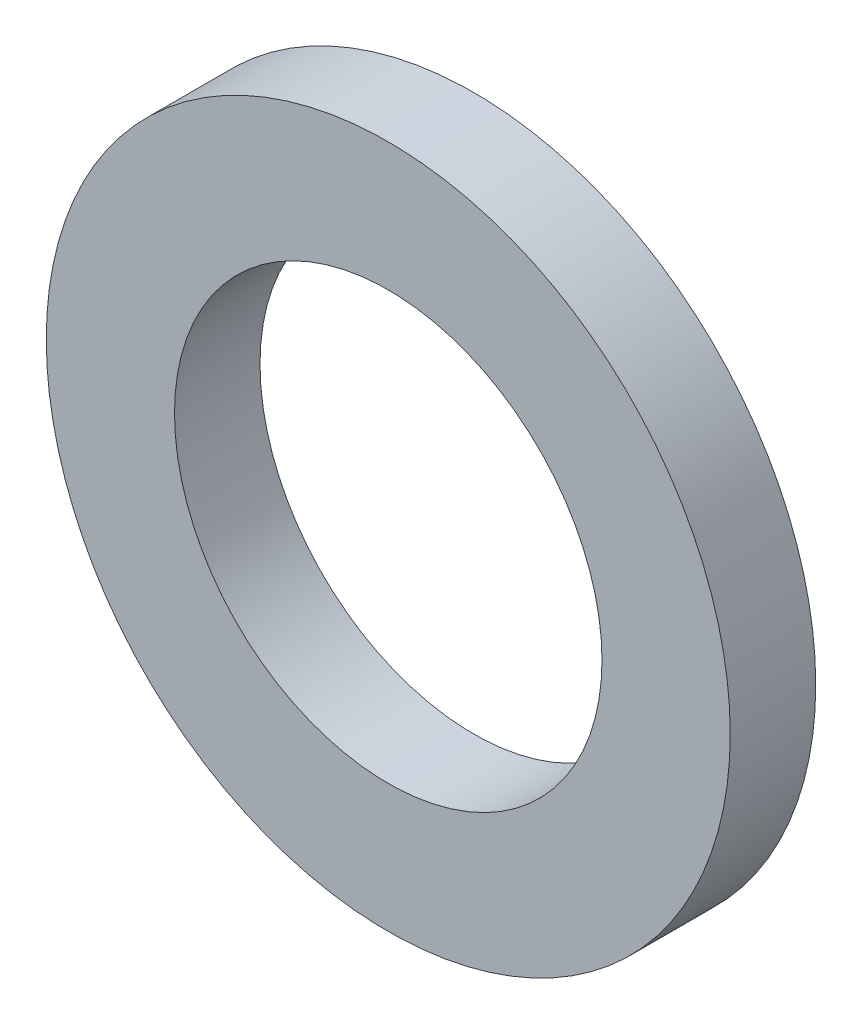
ISO-10303-21;
HEADER;
FILE_DESCRIPTION(('STEP AP214'),'2;1');
FILE_NAME('part.step','',(''),(''),'','','');
FILE_SCHEMA(('AUTOMOTIVE_DESIGN { 1 0 10303 214 1 1 1 1 }'));
ENDSEC;
DATA;
#1=APPLICATION_CONTEXT('core data for automotive mechanical design processes');
#2=APPLICATION_PROTOCOL_DEFINITION('international standard','automotive_design',2000,#1);
#3=PRODUCT_CONTEXT('',#1,'mechanical');
#4=PRODUCT('Part','Part','',(#3));
#5=PRODUCT_RELATED_PRODUCT_CATEGORY('part','',(#4));
#6=PRODUCT_DEFINITION_FORMATION('','',#4);
#7=PRODUCT_DEFINITION_CONTEXT('part definition',#1,'design');
#8=PRODUCT_DEFINITION('design','',#6,#7);
#9=PRODUCT_DEFINITION_SHAPE('','',#8);
#10=(LENGTH_UNIT() NAMED_UNIT(*) SI_UNIT(.MILLI.,.METRE.));
#11=(NAMED_UNIT(*) PLANE_ANGLE_UNIT() SI_UNIT($,.RADIAN.));
#12=(NAMED_UNIT(*) SI_UNIT($,.STERADIAN.) SOLID_ANGLE_UNIT());
#13=UNCERTAINTY_MEASURE_WITH_UNIT(LENGTH_MEASURE(1.E-05),#10,'distance_accuracy_value','');
#14=(GEOMETRIC_REPRESENTATION_CONTEXT(3) GLOBAL_UNCERTAINTY_ASSIGNED_CONTEXT((#13)) GLOBAL_UNIT_ASSIGNED_CONTEXT((#10,
#11,#12)) REPRESENTATION_CONTEXT('',''));
#15=CARTESIAN_POINT('',(0.,0.,0.));
#16=DIRECTION('',(0.,0.,1.));
#17=DIRECTION('',(1.,0.,0.));
#18=AXIS2_PLACEMENT_3D('',#15,#16,#17);
#19=CARTESIAN_POINT('',(0.,0.,3.175));
#20=DIRECTION('',(0.,0.,1.));
#21=DIRECTION('',(1.,0.,0.));
#22=AXIS2_PLACEMENT_3D('',#19,#20,#21);
#23=PLANE('',#22);
#24=CARTESIAN_POINT('',(0.,0.,3.175));
#25=DIRECTION('',(0.,0.,1.));
#26=DIRECTION('',(1.,0.,0.));
#27=AXIS2_PLACEMENT_3D('',#24,#25,#26);
#28=CIRCLE('',#27,12.7);
#29=CARTESIAN_POINT('',(12.7,0.,3.175));
#30=VERTEX_POINT('',#29);
#31=EDGE_CURVE('E10',#30,#30,#28,.T.);
#32=ORIENTED_EDGE('',*,*,#31,.T.);
#33=EDGE_LOOP('',(#32));
#34=FACE_BOUND('',#33,.T.);
#35=CARTESIAN_POINT('',(0.,0.,3.175));
#36=DIRECTION('',(0.,0.,1.));
#37=DIRECTION('',(1.,0.,0.));
#38=AXIS2_PLACEMENT_3D('',#35,#36,#37);
#39=CIRCLE('',#38,7.9375);
#40=CARTESIAN_POINT('',(7.9375,0.,3.175));
#41=VERTEX_POINT('',#40);
#42=EDGE_CURVE('E42',#41,#41,#39,.T.);
#43=ORIENTED_EDGE('',*,*,#42,.F.);
#44=EDGE_LOOP('',(#43));
#45=FACE_BOUND('',#44,.T.);
#46=ADVANCED_FACE('F31',(#34,#45),#23,.T.);
#47=CARTESIAN_POINT('',(0.,0.,0.));
#48=DIRECTION('',(0.,0.,1.));
#49=DIRECTION('',(1.,0.,0.));
#50=AXIS2_PLACEMENT_3D('',#47,#48,#49);
#51=PLANE('',#50);
#52=CARTESIAN_POINT('',(0.,0.,0.));
#53=DIRECTION('',(0.,0.,1.));
#54=DIRECTION('',(1.,0.,0.));
#55=AXIS2_PLACEMENT_3D('',#52,#53,#54);
#56=CIRCLE('',#55,12.7);
#57=CARTESIAN_POINT('',(12.7,0.,0.));
#58=VERTEX_POINT('',#57);
#59=EDGE_CURVE('E35',#58,#58,#56,.T.);
#60=ORIENTED_EDGE('',*,*,#59,.F.);
#61=EDGE_LOOP('',(#60));
#62=FACE_BOUND('',#61,.T.);
#63=CARTESIAN_POINT('',(0.,0.,0.));
#64=DIRECTION('',(0.,0.,1.));
#65=DIRECTION('',(1.,0.,0.));
#66=AXIS2_PLACEMENT_3D('',#63,#64,#65);
#67=CIRCLE('',#66,7.9375);
#68=CARTESIAN_POINT('',(7.9375,0.,0.));
#69=VERTEX_POINT('',#68);
#70=EDGE_CURVE('E44',#69,#69,#67,.T.);
#71=ORIENTED_EDGE('',*,*,#70,.T.);
#72=EDGE_LOOP('',(#71));
#73=FACE_BOUND('',#72,.T.);
#74=ADVANCED_FACE('F54',(#62,#73),#51,.F.);
#75=CARTESIAN_POINT('',(0.,0.,3.175));
#76=DIRECTION('',(0.,0.,-1.));
#77=DIRECTION('',(-1.,0.,0.));
#78=AXIS2_PLACEMENT_3D('',#75,#76,#77);
#79=CYLINDRICAL_SURFACE('',#78,12.7);
#80=ORIENTED_EDGE('',*,*,#31,.F.);
#81=EDGE_LOOP('',(#80));
#82=FACE_BOUND('',#81,.T.);
#83=ORIENTED_EDGE('',*,*,#59,.T.);
#84=EDGE_LOOP('',(#83));
#85=FACE_BOUND('',#84,.T.);
#86=ADVANCED_FACE('F33',(#82,#85),#79,.T.);
#87=CARTESIAN_POINT('',(0.,0.,3.175));
#88=DIRECTION('',(0.,0.,-1.));
#89=DIRECTION('',(-1.,0.,0.));
#90=AXIS2_PLACEMENT_3D('',#87,#88,#89);
#91=CYLINDRICAL_SURFACE('',#90,7.9375);
#92=ORIENTED_EDGE('',*,*,#42,.T.);
#93=EDGE_LOOP('',(#92));
#94=FACE_BOUND('',#93,.T.);
#95=ORIENTED_EDGE('',*,*,#70,.F.);
#96=EDGE_LOOP('',(#95));
#97=FACE_BOUND('',#96,.T.);
#98=ADVANCED_FACE('F50',(#94,#97),#91,.F.);
#99=CLOSED_SHELL('',(#46,#74,#86,#98));
#100=MANIFOLD_SOLID_BREP('B2',#99);
#101=ADVANCED_BREP_SHAPE_REPRESENTATION('',(#18,#100),#14);
#102=SHAPE_DEFINITION_REPRESENTATION(#9,#101);
ENDSEC;
END-ISO-10303-21;
